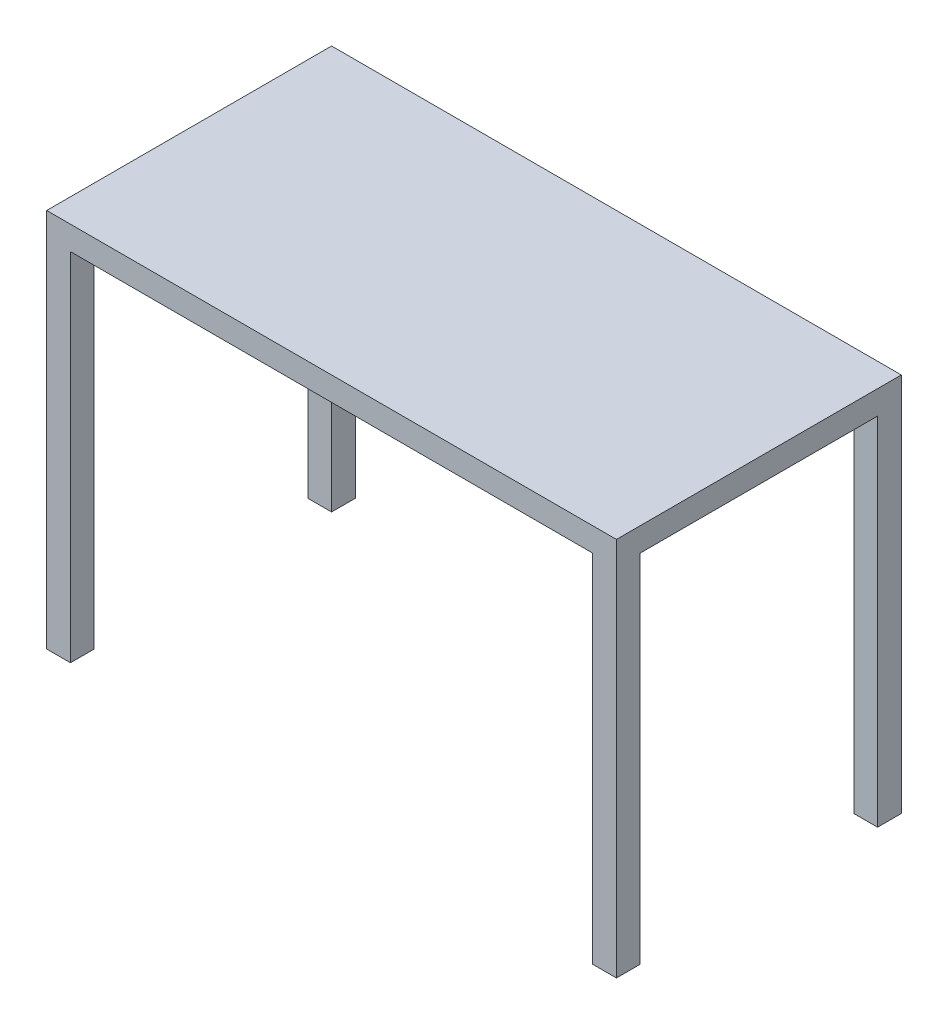
ISO-10303-21;
HEADER;
FILE_DESCRIPTION(('STEP AP214'),'2;1');
FILE_NAME('part.step','',(''),(''),'','','');
FILE_SCHEMA(('AUTOMOTIVE_DESIGN { 1 0 10303 214 1 1 1 1 }'));
ENDSEC;
DATA;
#1=APPLICATION_CONTEXT('core data for automotive mechanical design processes');
#2=APPLICATION_PROTOCOL_DEFINITION('international standard','automotive_design',2000,#1);
#3=PRODUCT_CONTEXT('',#1,'mechanical');
#4=PRODUCT('Part','Part','',(#3));
#5=PRODUCT_RELATED_PRODUCT_CATEGORY('part','',(#4));
#6=PRODUCT_DEFINITION_FORMATION('','',#4);
#7=PRODUCT_DEFINITION_CONTEXT('part definition',#1,'design');
#8=PRODUCT_DEFINITION('design','',#6,#7);
#9=PRODUCT_DEFINITION_SHAPE('','',#8);
#10=(LENGTH_UNIT() NAMED_UNIT(*) SI_UNIT(.MILLI.,.METRE.));
#11=(NAMED_UNIT(*) PLANE_ANGLE_UNIT() SI_UNIT($,.RADIAN.));
#12=(NAMED_UNIT(*) SI_UNIT($,.STERADIAN.) SOLID_ANGLE_UNIT());
#13=UNCERTAINTY_MEASURE_WITH_UNIT(LENGTH_MEASURE(1.E-05),#10,'distance_accuracy_value','');
#14=(GEOMETRIC_REPRESENTATION_CONTEXT(3) GLOBAL_UNCERTAINTY_ASSIGNED_CONTEXT((#13)) GLOBAL_UNIT_ASSIGNED_CONTEXT((#10,
#11,#12)) REPRESENTATION_CONTEXT('',''));
#15=CARTESIAN_POINT('',(0.,0.,0.));
#16=DIRECTION('',(0.,0.,1.));
#17=DIRECTION('',(1.,0.,0.));
#18=AXIS2_PLACEMENT_3D('',#15,#16,#17);
#19=CARTESIAN_POINT('',(0.,0.,0.));
#20=DIRECTION('',(0.,1.,0.));
#21=DIRECTION('',(0.,0.,1.));
#22=AXIS2_PLACEMENT_3D('',#19,#20,#21);
#23=PLANE('',#22);
#24=DIRECTION('',(-1.,0.,0.));
#25=VECTOR('',#24,1.);
#26=CARTESIAN_POINT('',(304.8,0.,-254.));
#27=LINE('',#26,#25);
#28=CARTESIAN_POINT('',(304.8,0.,-254.));
#29=VERTEX_POINT('',#28);
#30=CARTESIAN_POINT('',(254.,0.,-254.));
#31=VERTEX_POINT('',#30);
#32=EDGE_CURVE('E184',#29,#31,#27,.T.);
#33=ORIENTED_EDGE('',*,*,#32,.F.);
#34=DIRECTION('',(0.,0.,1.));
#35=VECTOR('',#34,1.);
#36=CARTESIAN_POINT('',(304.8,0.,0.));
#37=LINE('',#36,#35);
#38=CARTESIAN_POINT('',(304.8,0.,254.));
#39=VERTEX_POINT('',#38);
#40=EDGE_CURVE('E235',#29,#39,#37,.T.);
#41=ORIENTED_EDGE('',*,*,#40,.T.);
#42=DIRECTION('',(1.,0.,0.));
#43=VECTOR('',#42,1.);
#44=CARTESIAN_POINT('',(304.8,0.,254.));
#45=LINE('',#44,#43);
#46=CARTESIAN_POINT('',(254.,0.,254.));
#47=VERTEX_POINT('',#46);
#48=EDGE_CURVE('E196',#47,#39,#45,.T.);
#49=ORIENTED_EDGE('',*,*,#48,.F.);
#50=DIRECTION('',(0.,0.,-1.));
#51=VECTOR('',#50,1.);
#52=CARTESIAN_POINT('',(254.,0.,304.8));
#53=LINE('',#52,#51);
#54=CARTESIAN_POINT('',(254.,0.,304.8));
#55=VERTEX_POINT('',#54);
#56=EDGE_CURVE('E202',#55,#47,#53,.T.);
#57=ORIENTED_EDGE('',*,*,#56,.F.);
#58=DIRECTION('',(1.,0.,0.));
#59=VECTOR('',#58,1.);
#60=CARTESIAN_POINT('',(-914.4,0.,304.8));
#61=LINE('',#60,#59);
#62=CARTESIAN_POINT('',(-863.6,0.,304.8));
#63=VERTEX_POINT('',#62);
#64=EDGE_CURVE('E307',#63,#55,#61,.T.);
#65=ORIENTED_EDGE('',*,*,#64,.F.);
#66=DIRECTION('',(0.,0.,1.));
#67=VECTOR('',#66,1.);
#68=CARTESIAN_POINT('',(-863.6,0.,304.8));
#69=LINE('',#68,#67);
#70=CARTESIAN_POINT('',(-863.6,0.,254.));
#71=VERTEX_POINT('',#70);
#72=EDGE_CURVE('E275',#71,#63,#69,.T.);
#73=ORIENTED_EDGE('',*,*,#72,.F.);
#74=DIRECTION('',(1.,0.,0.));
#75=VECTOR('',#74,1.);
#76=CARTESIAN_POINT('',(-914.4,0.,254.));
#77=LINE('',#76,#75);
#78=CARTESIAN_POINT('',(-914.4,0.,254.));
#79=VERTEX_POINT('',#78);
#80=EDGE_CURVE('E269',#79,#71,#77,.T.);
#81=ORIENTED_EDGE('',*,*,#80,.F.);
#82=DIRECTION('',(0.,0.,1.));
#83=VECTOR('',#82,1.);
#84=CARTESIAN_POINT('',(-914.4,0.,-304.8));
#85=LINE('',#84,#83);
#86=CARTESIAN_POINT('',(-914.4,0.,-254.));
#87=VERTEX_POINT('',#86);
#88=EDGE_CURVE('E316',#87,#79,#85,.T.);
#89=ORIENTED_EDGE('',*,*,#88,.F.);
#90=DIRECTION('',(-1.,0.,0.));
#91=VECTOR('',#90,1.);
#92=CARTESIAN_POINT('',(-914.4,0.,-254.));
#93=LINE('',#92,#91);
#94=CARTESIAN_POINT('',(-863.6,0.,-254.));
#95=VERTEX_POINT('',#94);
#96=EDGE_CURVE('E244',#95,#87,#93,.T.);
#97=ORIENTED_EDGE('',*,*,#96,.F.);
#98=DIRECTION('',(0.,0.,1.));
#99=VECTOR('',#98,1.);
#100=CARTESIAN_POINT('',(-863.6,0.,-304.8));
#101=LINE('',#100,#99);
#102=CARTESIAN_POINT('',(-863.6,0.,-304.8));
#103=VERTEX_POINT('',#102);
#104=EDGE_CURVE('E238',#103,#95,#101,.T.);
#105=ORIENTED_EDGE('',*,*,#104,.F.);
#106=DIRECTION('',(-1.,0.,0.));
#107=VECTOR('',#106,1.);
#108=CARTESIAN_POINT('',(-914.4,0.,-304.8));
#109=LINE('',#108,#107);
#110=CARTESIAN_POINT('',(254.,0.,-304.8));
#111=VERTEX_POINT('',#110);
#112=EDGE_CURVE('E62',#111,#103,#109,.T.);
#113=ORIENTED_EDGE('',*,*,#112,.F.);
#114=DIRECTION('',(0.,0.,-1.));
#115=VECTOR('',#114,1.);
#116=CARTESIAN_POINT('',(254.,0.,-304.8));
#117=LINE('',#116,#115);
#118=EDGE_CURVE('E57',#31,#111,#117,.T.);
#119=ORIENTED_EDGE('',*,*,#118,.F.);
#120=EDGE_LOOP('',(#33,#41,#49,#57,#65,#73,#81,#89,#97,#105,#113,#119));
#121=FACE_BOUND('',#120,.T.);
#122=ADVANCED_FACE('F41',(#121),#23,.F.);
#123=CARTESIAN_POINT('',(-914.4,50.8,-304.8));
#124=DIRECTION('',(0.,0.,1.));
#125=DIRECTION('',(1.,0.,0.));
#126=AXIS2_PLACEMENT_3D('',#123,#124,#125);
#127=PLANE('',#126);
#128=DIRECTION('',(-1.,0.,0.));
#129=VECTOR('',#128,1.);
#130=CARTESIAN_POINT('',(-914.4,50.8,-304.8));
#131=LINE('',#130,#129);
#132=CARTESIAN_POINT('',(304.8,50.8,-304.8));
#133=VERTEX_POINT('',#132);
#134=CARTESIAN_POINT('',(-914.4,50.8,-304.8));
#135=VERTEX_POINT('',#134);
#136=EDGE_CURVE('E303',#133,#135,#131,.T.);
#137=ORIENTED_EDGE('',*,*,#136,.F.);
#138=DIRECTION('',(0.,-1.,0.));
#139=VECTOR('',#138,1.);
#140=CARTESIAN_POINT('',(304.8,-762.,-304.8));
#141=LINE('',#140,#139);
#142=CARTESIAN_POINT('',(304.8,-762.,-304.8));
#143=VERTEX_POINT('',#142);
#144=EDGE_CURVE('E164',#133,#143,#141,.T.);
#145=ORIENTED_EDGE('',*,*,#144,.T.);
#146=DIRECTION('',(1.,0.,0.));
#147=VECTOR('',#146,1.);
#148=CARTESIAN_POINT('',(304.8,-762.,-304.8));
#149=LINE('',#148,#147);
#150=CARTESIAN_POINT('',(254.,-762.,-304.8));
#151=VERTEX_POINT('',#150);
#152=EDGE_CURVE('E160',#151,#143,#149,.T.);
#153=ORIENTED_EDGE('',*,*,#152,.F.);
#154=DIRECTION('',(0.,1.,0.));
#155=VECTOR('',#154,1.);
#156=CARTESIAN_POINT('',(254.,-833.842048968553,-304.8));
#157=LINE('',#156,#155);
#158=EDGE_CURVE('E152',#151,#111,#157,.T.);
#159=ORIENTED_EDGE('',*,*,#158,.T.);
#160=ORIENTED_EDGE('',*,*,#112,.T.);
#161=DIRECTION('',(0.,1.,0.));
#162=VECTOR('',#161,1.);
#163=CARTESIAN_POINT('',(-863.6,-762.,-304.8));
#164=LINE('',#163,#162);
#165=CARTESIAN_POINT('',(-863.6,-762.,-304.8));
#166=VERTEX_POINT('',#165);
#167=EDGE_CURVE('E265',#166,#103,#164,.T.);
#168=ORIENTED_EDGE('',*,*,#167,.F.);
#169=DIRECTION('',(1.,0.,0.));
#170=VECTOR('',#169,1.);
#171=CARTESIAN_POINT('',(-914.4,-762.,-304.8));
#172=LINE('',#171,#170);
#173=CARTESIAN_POINT('',(-914.4,-762.,-304.8));
#174=VERTEX_POINT('',#173);
#175=EDGE_CURVE('E243',#174,#166,#172,.T.);
#176=ORIENTED_EDGE('',*,*,#175,.F.);
#177=DIRECTION('',(0.,-1.,0.));
#178=VECTOR('',#177,1.);
#179=CARTESIAN_POINT('',(-914.4,50.8,-304.8));
#180=LINE('',#179,#178);
#181=EDGE_CURVE('E11',#135,#174,#180,.T.);
#182=ORIENTED_EDGE('',*,*,#181,.F.);
#183=EDGE_LOOP('',(#137,#145,#153,#159,#160,#168,#176,#182));
#184=FACE_BOUND('',#183,.T.);
#185=ADVANCED_FACE('F43',(#184),#127,.F.);
#186=CARTESIAN_POINT('',(-914.4,50.8,-304.8));
#187=DIRECTION('',(1.,0.,0.));
#188=DIRECTION('',(0.,0.,-1.));
#189=AXIS2_PLACEMENT_3D('',#186,#187,#188);
#190=PLANE('',#189);
#191=ORIENTED_EDGE('',*,*,#181,.T.);
#192=DIRECTION('',(0.,0.,-1.));
#193=VECTOR('',#192,1.);
#194=CARTESIAN_POINT('',(-914.4,-762.,-304.8));
#195=LINE('',#194,#193);
#196=CARTESIAN_POINT('',(-914.4,-762.,-254.));
#197=VERTEX_POINT('',#196);
#198=EDGE_CURVE('E239',#197,#174,#195,.T.);
#199=ORIENTED_EDGE('',*,*,#198,.F.);
#200=DIRECTION('',(0.,1.,0.));
#201=VECTOR('',#200,1.);
#202=CARTESIAN_POINT('',(-914.4,-762.,-254.));
#203=LINE('',#202,#201);
#204=EDGE_CURVE('E253',#197,#87,#203,.T.);
#205=ORIENTED_EDGE('',*,*,#204,.T.);
#206=ORIENTED_EDGE('',*,*,#88,.T.);
#207=DIRECTION('',(0.,1.,0.));
#208=VECTOR('',#207,1.);
#209=CARTESIAN_POINT('',(-914.4,-762.,254.));
#210=LINE('',#209,#208);
#211=CARTESIAN_POINT('',(-914.4,-762.,254.));
#212=VERTEX_POINT('',#211);
#213=EDGE_CURVE('E299',#212,#79,#210,.T.);
#214=ORIENTED_EDGE('',*,*,#213,.F.);
#215=DIRECTION('',(0.,0.,-1.));
#216=VECTOR('',#215,1.);
#217=CARTESIAN_POINT('',(-914.4,-762.,304.8));
#218=LINE('',#217,#216);
#219=CARTESIAN_POINT('',(-914.4,-762.,304.8));
#220=VERTEX_POINT('',#219);
#221=EDGE_CURVE('E270',#220,#212,#218,.T.);
#222=ORIENTED_EDGE('',*,*,#221,.F.);
#223=DIRECTION('',(0.,-1.,0.));
#224=VECTOR('',#223,1.);
#225=CARTESIAN_POINT('',(-914.4,50.8,304.8));
#226=LINE('',#225,#224);
#227=CARTESIAN_POINT('',(-914.4,50.8,304.8));
#228=VERTEX_POINT('',#227);
#229=EDGE_CURVE('E50',#228,#220,#226,.T.);
#230=ORIENTED_EDGE('',*,*,#229,.F.);
#231=DIRECTION('',(0.,0.,1.));
#232=VECTOR('',#231,1.);
#233=CARTESIAN_POINT('',(-914.4,50.8,-304.8));
#234=LINE('',#233,#232);
#235=EDGE_CURVE('E306',#135,#228,#234,.T.);
#236=ORIENTED_EDGE('',*,*,#235,.F.);
#237=EDGE_LOOP('',(#191,#199,#205,#206,#214,#222,#230,#236));
#238=FACE_BOUND('',#237,.T.);
#239=ADVANCED_FACE('F336',(#238),#190,.F.);
#240=CARTESIAN_POINT('',(-914.4,50.8,304.8));
#241=DIRECTION('',(0.,0.,-1.));
#242=DIRECTION('',(-1.,0.,0.));
#243=AXIS2_PLACEMENT_3D('',#240,#241,#242);
#244=PLANE('',#243);
#245=ORIENTED_EDGE('',*,*,#64,.T.);
#246=DIRECTION('',(0.,1.,0.));
#247=VECTOR('',#246,1.);
#248=CARTESIAN_POINT('',(254.,-833.842048968553,304.8));
#249=LINE('',#248,#247);
#250=CARTESIAN_POINT('',(254.,-762.,304.8));
#251=VERTEX_POINT('',#250);
#252=EDGE_CURVE('E180',#251,#55,#249,.T.);
#253=ORIENTED_EDGE('',*,*,#252,.F.);
#254=DIRECTION('',(-1.,0.,0.));
#255=VECTOR('',#254,1.);
#256=CARTESIAN_POINT('',(304.8,-762.,304.8));
#257=LINE('',#256,#255);
#258=CARTESIAN_POINT('',(304.8,-762.,304.8));
#259=VERTEX_POINT('',#258);
#260=EDGE_CURVE('E211',#259,#251,#257,.T.);
#261=ORIENTED_EDGE('',*,*,#260,.F.);
#262=DIRECTION('',(0.,-1.,0.));
#263=VECTOR('',#262,1.);
#264=CARTESIAN_POINT('',(304.8,-762.,304.8));
#265=LINE('',#264,#263);
#266=CARTESIAN_POINT('',(304.8,50.8,304.8));
#267=VERTEX_POINT('',#266);
#268=EDGE_CURVE('E210',#267,#259,#265,.T.);
#269=ORIENTED_EDGE('',*,*,#268,.F.);
#270=DIRECTION('',(1.,0.,0.));
#271=VECTOR('',#270,1.);
#272=CARTESIAN_POINT('',(-914.4,50.8,304.8));
#273=LINE('',#272,#271);
#274=EDGE_CURVE('E310',#228,#267,#273,.T.);
#275=ORIENTED_EDGE('',*,*,#274,.F.);
#276=ORIENTED_EDGE('',*,*,#229,.T.);
#277=DIRECTION('',(-1.,0.,0.));
#278=VECTOR('',#277,1.);
#279=CARTESIAN_POINT('',(-914.4,-762.,304.8));
#280=LINE('',#279,#278);
#281=CARTESIAN_POINT('',(-863.6,-762.,304.8));
#282=VERTEX_POINT('',#281);
#283=EDGE_CURVE('E281',#282,#220,#280,.T.);
#284=ORIENTED_EDGE('',*,*,#283,.F.);
#285=DIRECTION('',(0.,1.,0.));
#286=VECTOR('',#285,1.);
#287=CARTESIAN_POINT('',(-863.6,-762.,304.8));
#288=LINE('',#287,#286);
#289=EDGE_CURVE('E285',#282,#63,#288,.T.);
#290=ORIENTED_EDGE('',*,*,#289,.T.);
#291=EDGE_LOOP('',(#245,#253,#261,#269,#275,#276,#284,#290));
#292=FACE_BOUND('',#291,.T.);
#293=ADVANCED_FACE('F326',(#292),#244,.F.);
#294=CARTESIAN_POINT('',(0.,50.8,0.));
#295=DIRECTION('',(0.,1.,0.));
#296=DIRECTION('',(0.,0.,1.));
#297=AXIS2_PLACEMENT_3D('',#294,#295,#296);
#298=PLANE('',#297);
#299=DIRECTION('',(0.,0.,1.));
#300=VECTOR('',#299,1.);
#301=CARTESIAN_POINT('',(304.8,50.8,-304.8));
#302=LINE('',#301,#300);
#303=EDGE_CURVE('E230',#133,#267,#302,.T.);
#304=ORIENTED_EDGE('',*,*,#303,.F.);
#305=ORIENTED_EDGE('',*,*,#136,.T.);
#306=ORIENTED_EDGE('',*,*,#235,.T.);
#307=ORIENTED_EDGE('',*,*,#274,.T.);
#308=EDGE_LOOP('',(#304,#305,#306,#307));
#309=FACE_BOUND('',#308,.T.);
#310=ADVANCED_FACE('F355',(#309),#298,.T.);
#311=CARTESIAN_POINT('',(-914.4,-762.,254.));
#312=DIRECTION('',(0.,0.,1.));
#313=DIRECTION('',(1.,0.,0.));
#314=AXIS2_PLACEMENT_3D('',#311,#312,#313);
#315=PLANE('',#314);
#316=ORIENTED_EDGE('',*,*,#80,.T.);
#317=DIRECTION('',(0.,1.,0.));
#318=VECTOR('',#317,1.);
#319=CARTESIAN_POINT('',(-863.6,-762.,254.));
#320=LINE('',#319,#318);
#321=CARTESIAN_POINT('',(-863.6,-762.,254.));
#322=VERTEX_POINT('',#321);
#323=EDGE_CURVE('E295',#322,#71,#320,.T.);
#324=ORIENTED_EDGE('',*,*,#323,.F.);
#325=DIRECTION('',(1.,0.,0.));
#326=VECTOR('',#325,1.);
#327=CARTESIAN_POINT('',(-914.4,-762.,254.));
#328=LINE('',#327,#326);
#329=EDGE_CURVE('E274',#212,#322,#328,.T.);
#330=ORIENTED_EDGE('',*,*,#329,.F.);
#331=ORIENTED_EDGE('',*,*,#213,.T.);
#332=EDGE_LOOP('',(#316,#324,#330,#331));
#333=FACE_BOUND('',#332,.T.);
#334=ADVANCED_FACE('F340',(#333),#315,.F.);
#335=CARTESIAN_POINT('',(-863.6,-762.,304.8));
#336=DIRECTION('',(-1.,0.,0.));
#337=DIRECTION('',(0.,0.,1.));
#338=AXIS2_PLACEMENT_3D('',#335,#336,#337);
#339=PLANE('',#338);
#340=ORIENTED_EDGE('',*,*,#72,.T.);
#341=ORIENTED_EDGE('',*,*,#289,.F.);
#342=DIRECTION('',(0.,0.,1.));
#343=VECTOR('',#342,1.);
#344=CARTESIAN_POINT('',(-863.6,-762.,304.8));
#345=LINE('',#344,#343);
#346=EDGE_CURVE('E278',#322,#282,#345,.T.);
#347=ORIENTED_EDGE('',*,*,#346,.F.);
#348=ORIENTED_EDGE('',*,*,#323,.T.);
#349=EDGE_LOOP('',(#340,#341,#347,#348));
#350=FACE_BOUND('',#349,.T.);
#351=ADVANCED_FACE('F343',(#350),#339,.F.);
#352=CARTESIAN_POINT('',(0.,-762.,0.));
#353=DIRECTION('',(0.,-1.,0.));
#354=DIRECTION('',(0.,0.,-1.));
#355=AXIS2_PLACEMENT_3D('',#352,#353,#354);
#356=PLANE('',#355);
#357=ORIENTED_EDGE('',*,*,#221,.T.);
#358=ORIENTED_EDGE('',*,*,#329,.T.);
#359=ORIENTED_EDGE('',*,*,#346,.T.);
#360=ORIENTED_EDGE('',*,*,#283,.T.);
#361=EDGE_LOOP('',(#357,#358,#359,#360));
#362=FACE_BOUND('',#361,.T.);
#363=ADVANCED_FACE('F332',(#362),#356,.T.);
#364=CARTESIAN_POINT('',(-863.6,-762.,-304.8));
#365=DIRECTION('',(-1.,0.,0.));
#366=DIRECTION('',(0.,0.,1.));
#367=AXIS2_PLACEMENT_3D('',#364,#365,#366);
#368=PLANE('',#367);
#369=ORIENTED_EDGE('',*,*,#104,.T.);
#370=DIRECTION('',(0.,1.,0.));
#371=VECTOR('',#370,1.);
#372=CARTESIAN_POINT('',(-863.6,-762.,-254.));
#373=LINE('',#372,#371);
#374=CARTESIAN_POINT('',(-863.6,-762.,-254.));
#375=VERTEX_POINT('',#374);
#376=EDGE_CURVE('E261',#375,#95,#373,.T.);
#377=ORIENTED_EDGE('',*,*,#376,.F.);
#378=DIRECTION('',(0.,0.,1.));
#379=VECTOR('',#378,1.);
#380=CARTESIAN_POINT('',(-863.6,-762.,-304.8));
#381=LINE('',#380,#379);
#382=EDGE_CURVE('E247',#166,#375,#381,.T.);
#383=ORIENTED_EDGE('',*,*,#382,.F.);
#384=ORIENTED_EDGE('',*,*,#167,.T.);
#385=EDGE_LOOP('',(#369,#377,#383,#384));
#386=FACE_BOUND('',#385,.T.);
#387=ADVANCED_FACE('F412',(#386),#368,.F.);
#388=CARTESIAN_POINT('',(-914.4,-762.,-254.));
#389=DIRECTION('',(0.,0.,-1.));
#390=DIRECTION('',(-1.,0.,0.));
#391=AXIS2_PLACEMENT_3D('',#388,#389,#390);
#392=PLANE('',#391);
#393=ORIENTED_EDGE('',*,*,#96,.T.);
#394=ORIENTED_EDGE('',*,*,#204,.F.);
#395=DIRECTION('',(-1.,0.,0.));
#396=VECTOR('',#395,1.);
#397=CARTESIAN_POINT('',(-914.4,-762.,-254.));
#398=LINE('',#397,#396);
#399=EDGE_CURVE('E250',#375,#197,#398,.T.);
#400=ORIENTED_EDGE('',*,*,#399,.F.);
#401=ORIENTED_EDGE('',*,*,#376,.T.);
#402=EDGE_LOOP('',(#393,#394,#400,#401));
#403=FACE_BOUND('',#402,.T.);
#404=ADVANCED_FACE('F367',(#403),#392,.F.);
#405=CARTESIAN_POINT('',(0.,-762.,0.));
#406=DIRECTION('',(0.,1.,0.));
#407=DIRECTION('',(0.,0.,1.));
#408=AXIS2_PLACEMENT_3D('',#405,#406,#407);
#409=PLANE('',#408);
#410=ORIENTED_EDGE('',*,*,#198,.T.);
#411=ORIENTED_EDGE('',*,*,#175,.T.);
#412=ORIENTED_EDGE('',*,*,#382,.T.);
#413=ORIENTED_EDGE('',*,*,#399,.T.);
#414=EDGE_LOOP('',(#410,#411,#412,#413));
#415=FACE_BOUND('',#414,.T.);
#416=ADVANCED_FACE('F362',(#415),#409,.F.);
#417=CARTESIAN_POINT('',(304.8,-762.,-304.8));
#418=DIRECTION('',(-1.,0.,0.));
#419=DIRECTION('',(0.,-1.,0.));
#420=AXIS2_PLACEMENT_3D('',#417,#418,#419);
#421=PLANE('',#420);
#422=ORIENTED_EDGE('',*,*,#144,.F.);
#423=ORIENTED_EDGE('',*,*,#303,.T.);
#424=ORIENTED_EDGE('',*,*,#268,.T.);
#425=DIRECTION('',(0.,0.,1.));
#426=VECTOR('',#425,1.);
#427=CARTESIAN_POINT('',(304.8,-762.,304.8));
#428=LINE('',#427,#426);
#429=CARTESIAN_POINT('',(304.8,-762.,254.));
#430=VERTEX_POINT('',#429);
#431=EDGE_CURVE('E215',#430,#259,#428,.T.);
#432=ORIENTED_EDGE('',*,*,#431,.F.);
#433=DIRECTION('',(0.,1.,0.));
#434=VECTOR('',#433,1.);
#435=CARTESIAN_POINT('',(304.8,-833.842048968553,254.));
#436=LINE('',#435,#434);
#437=EDGE_CURVE('E175',#430,#39,#436,.T.);
#438=ORIENTED_EDGE('',*,*,#437,.T.);
#439=ORIENTED_EDGE('',*,*,#40,.F.);
#440=DIRECTION('',(0.,1.,0.));
#441=VECTOR('',#440,1.);
#442=CARTESIAN_POINT('',(304.8,-833.842048968553,-254.));
#443=LINE('',#442,#441);
#444=CARTESIAN_POINT('',(304.8,-762.,-254.));
#445=VERTEX_POINT('',#444);
#446=EDGE_CURVE('E189',#445,#29,#443,.T.);
#447=ORIENTED_EDGE('',*,*,#446,.F.);
#448=DIRECTION('',(0.,0.,1.));
#449=VECTOR('',#448,1.);
#450=CARTESIAN_POINT('',(304.8,-762.,-304.8));
#451=LINE('',#450,#449);
#452=EDGE_CURVE('E169',#143,#445,#451,.T.);
#453=ORIENTED_EDGE('',*,*,#452,.F.);
#454=EDGE_LOOP('',(#422,#423,#424,#432,#438,#439,#447,#453));
#455=FACE_BOUND('',#454,.T.);
#456=ADVANCED_FACE('F431',(#455),#421,.F.);
#457=CARTESIAN_POINT('',(254.,-833.842048968553,304.8));
#458=DIRECTION('',(1.,0.,0.));
#459=DIRECTION('',(0.,0.,-1.));
#460=AXIS2_PLACEMENT_3D('',#457,#458,#459);
#461=PLANE('',#460);
#462=DIRECTION('',(0.,0.,-1.));
#463=VECTOR('',#462,1.);
#464=CARTESIAN_POINT('',(254.,-762.,304.8));
#465=LINE('',#464,#463);
#466=CARTESIAN_POINT('',(254.,-762.,254.));
#467=VERTEX_POINT('',#466);
#468=EDGE_CURVE('E206',#251,#467,#465,.T.);
#469=ORIENTED_EDGE('',*,*,#468,.F.);
#470=ORIENTED_EDGE('',*,*,#252,.T.);
#471=ORIENTED_EDGE('',*,*,#56,.T.);
#472=DIRECTION('',(0.,1.,0.));
#473=VECTOR('',#472,1.);
#474=CARTESIAN_POINT('',(254.,-833.842048968553,254.));
#475=LINE('',#474,#473);
#476=EDGE_CURVE('E201',#467,#47,#475,.T.);
#477=ORIENTED_EDGE('',*,*,#476,.F.);
#478=EDGE_LOOP('',(#469,#470,#471,#477));
#479=FACE_BOUND('',#478,.T.);
#480=ADVANCED_FACE('F347',(#479),#461,.F.);
#481=CARTESIAN_POINT('',(304.8,-833.842048968553,254.));
#482=DIRECTION('',(0.,0.,1.));
#483=DIRECTION('',(1.,0.,0.));
#484=AXIS2_PLACEMENT_3D('',#481,#482,#483);
#485=PLANE('',#484);
#486=DIRECTION('',(1.,0.,0.));
#487=VECTOR('',#486,1.);
#488=CARTESIAN_POINT('',(304.8,-762.,254.));
#489=LINE('',#488,#487);
#490=EDGE_CURVE('E200',#467,#430,#489,.T.);
#491=ORIENTED_EDGE('',*,*,#490,.F.);
#492=ORIENTED_EDGE('',*,*,#476,.T.);
#493=ORIENTED_EDGE('',*,*,#48,.T.);
#494=ORIENTED_EDGE('',*,*,#437,.F.);
#495=EDGE_LOOP('',(#491,#492,#493,#494));
#496=FACE_BOUND('',#495,.T.);
#497=ADVANCED_FACE('F443',(#496),#485,.F.);
#498=CARTESIAN_POINT('',(0.,-762.,0.));
#499=DIRECTION('',(0.,-1.,0.));
#500=DIRECTION('',(0.,0.,-1.));
#501=AXIS2_PLACEMENT_3D('',#498,#499,#500);
#502=PLANE('',#501);
#503=ORIENTED_EDGE('',*,*,#490,.T.);
#504=ORIENTED_EDGE('',*,*,#431,.T.);
#505=ORIENTED_EDGE('',*,*,#260,.T.);
#506=ORIENTED_EDGE('',*,*,#468,.T.);
#507=EDGE_LOOP('',(#503,#504,#505,#506));
#508=FACE_BOUND('',#507,.T.);
#509=ADVANCED_FACE('F350',(#508),#502,.T.);
#510=CARTESIAN_POINT('',(304.8,-833.842048968553,-254.));
#511=DIRECTION('',(0.,0.,-1.));
#512=DIRECTION('',(-1.,0.,0.));
#513=AXIS2_PLACEMENT_3D('',#510,#511,#512);
#514=PLANE('',#513);
#515=DIRECTION('',(-1.,0.,0.));
#516=VECTOR('',#515,1.);
#517=CARTESIAN_POINT('',(304.8,-762.,-254.));
#518=LINE('',#517,#516);
#519=CARTESIAN_POINT('',(254.,-762.,-254.));
#520=VERTEX_POINT('',#519);
#521=EDGE_CURVE('E173',#445,#520,#518,.T.);
#522=ORIENTED_EDGE('',*,*,#521,.F.);
#523=ORIENTED_EDGE('',*,*,#446,.T.);
#524=ORIENTED_EDGE('',*,*,#32,.T.);
#525=DIRECTION('',(0.,1.,0.));
#526=VECTOR('',#525,1.);
#527=CARTESIAN_POINT('',(254.,-833.842048968553,-254.));
#528=LINE('',#527,#526);
#529=EDGE_CURVE('E193',#520,#31,#528,.T.);
#530=ORIENTED_EDGE('',*,*,#529,.F.);
#531=EDGE_LOOP('',(#522,#523,#524,#530));
#532=FACE_BOUND('',#531,.T.);
#533=ADVANCED_FACE('F457',(#532),#514,.F.);
#534=CARTESIAN_POINT('',(254.,-833.842048968553,-304.8));
#535=DIRECTION('',(1.,0.,0.));
#536=DIRECTION('',(0.,0.,-1.));
#537=AXIS2_PLACEMENT_3D('',#534,#535,#536);
#538=PLANE('',#537);
#539=DIRECTION('',(0.,0.,-1.));
#540=VECTOR('',#539,1.);
#541=CARTESIAN_POINT('',(254.,-762.,-304.8));
#542=LINE('',#541,#540);
#543=EDGE_CURVE('E156',#520,#151,#542,.T.);
#544=ORIENTED_EDGE('',*,*,#543,.F.);
#545=ORIENTED_EDGE('',*,*,#529,.T.);
#546=ORIENTED_EDGE('',*,*,#118,.T.);
#547=ORIENTED_EDGE('',*,*,#158,.F.);
#548=EDGE_LOOP('',(#544,#545,#546,#547));
#549=FACE_BOUND('',#548,.T.);
#550=ADVANCED_FACE('F154',(#549),#538,.F.);
#551=CARTESIAN_POINT('',(0.,-762.,0.));
#552=DIRECTION('',(0.,-1.,0.));
#553=DIRECTION('',(0.,0.,-1.));
#554=AXIS2_PLACEMENT_3D('',#551,#552,#553);
#555=PLANE('',#554);
#556=ORIENTED_EDGE('',*,*,#152,.T.);
#557=ORIENTED_EDGE('',*,*,#452,.T.);
#558=ORIENTED_EDGE('',*,*,#521,.T.);
#559=ORIENTED_EDGE('',*,*,#543,.T.);
#560=EDGE_LOOP('',(#556,#557,#558,#559));
#561=FACE_BOUND('',#560,.T.);
#562=ADVANCED_FACE('F172',(#561),#555,.T.);
#563=CLOSED_SHELL('',(#122,#185,#239,#293,#310,#334,#351,#363,#387,#404,#416,#456,#480,#497,
#509,#533,#550,#562));
#564=MANIFOLD_SOLID_BREP('B2',#563);
#565=ADVANCED_BREP_SHAPE_REPRESENTATION('',(#18,#564),#14);
#566=SHAPE_DEFINITION_REPRESENTATION(#9,#565);
ENDSEC;
END-ISO-10303-21;
